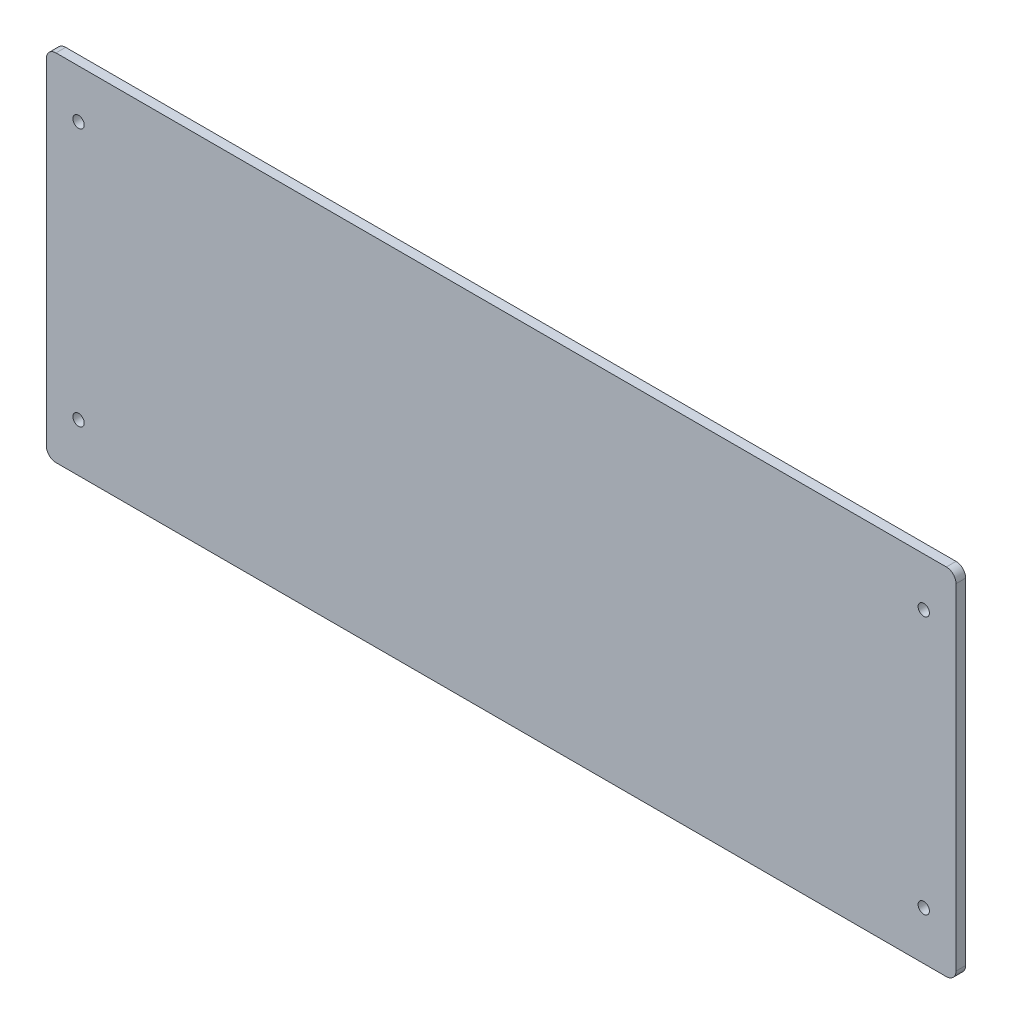
ISO-10303-21;
HEADER;
FILE_DESCRIPTION(('STEP AP214'),'2;1');
FILE_NAME('part.step','',(''),(''),'','','');
FILE_SCHEMA(('AUTOMOTIVE_DESIGN { 1 0 10303 214 1 1 1 1 }'));
ENDSEC;
DATA;
#1=APPLICATION_CONTEXT('core data for automotive mechanical design processes');
#2=APPLICATION_PROTOCOL_DEFINITION('international standard','automotive_design',2000,#1);
#3=PRODUCT_CONTEXT('',#1,'mechanical');
#4=PRODUCT('Part','Part','',(#3));
#5=PRODUCT_RELATED_PRODUCT_CATEGORY('part','',(#4));
#6=PRODUCT_DEFINITION_FORMATION('','',#4);
#7=PRODUCT_DEFINITION_CONTEXT('part definition',#1,'design');
#8=PRODUCT_DEFINITION('design','',#6,#7);
#9=PRODUCT_DEFINITION_SHAPE('','',#8);
#10=(LENGTH_UNIT() NAMED_UNIT(*) SI_UNIT(.MILLI.,.METRE.));
#11=(NAMED_UNIT(*) PLANE_ANGLE_UNIT() SI_UNIT($,.RADIAN.));
#12=(NAMED_UNIT(*) SI_UNIT($,.STERADIAN.) SOLID_ANGLE_UNIT());
#13=UNCERTAINTY_MEASURE_WITH_UNIT(LENGTH_MEASURE(1.E-05),#10,'distance_accuracy_value','');
#14=(GEOMETRIC_REPRESENTATION_CONTEXT(3) GLOBAL_UNCERTAINTY_ASSIGNED_CONTEXT((#13)) GLOBAL_UNIT_ASSIGNED_CONTEXT((#10,
#11,#12)) REPRESENTATION_CONTEXT('',''));
#15=CARTESIAN_POINT('',(0.,0.,0.));
#16=DIRECTION('',(0.,0.,1.));
#17=DIRECTION('',(1.,0.,0.));
#18=AXIS2_PLACEMENT_3D('',#15,#16,#17);
#19=CARTESIAN_POINT('',(-137.999999999996,227.000000000009,3.));
#20=DIRECTION('',(0.,0.,1.));
#21=DIRECTION('',(1.,0.,0.));
#22=AXIS2_PLACEMENT_3D('',#19,#20,#21);
#23=PLANE('',#22);
#24=CARTESIAN_POINT('',(130.999999999996,239.000000000009,3.));
#25=DIRECTION('',(0.,0.,1.));
#26=DIRECTION('',(-1.,0.,0.));
#27=AXIS2_PLACEMENT_3D('',#24,#25,#26);
#28=CIRCLE('',#27,1.75000000000001);
#29=CARTESIAN_POINT('',(129.249999999996,239.000000000009,3.));
#30=VERTEX_POINT('',#29);
#31=EDGE_CURVE('E225',#30,#30,#28,.T.);
#32=ORIENTED_EDGE('',*,*,#31,.F.);
#33=EDGE_LOOP('',(#32));
#34=FACE_BOUND('',#33,.T.);
#35=CARTESIAN_POINT('',(-130.999999999996,319.,3.));
#36=DIRECTION('',(0.,0.,1.));
#37=DIRECTION('',(1.,0.,0.));
#38=AXIS2_PLACEMENT_3D('',#35,#36,#37);
#39=CIRCLE('',#38,1.75000000000001);
#40=CARTESIAN_POINT('',(-129.249999999996,319.,3.));
#41=VERTEX_POINT('',#40);
#42=EDGE_CURVE('E150',#41,#41,#39,.T.);
#43=ORIENTED_EDGE('',*,*,#42,.F.);
#44=EDGE_LOOP('',(#43));
#45=FACE_BOUND('',#44,.T.);
#46=CARTESIAN_POINT('',(-137.999999999996,227.000000000009,3.));
#47=DIRECTION('',(0.,0.,1.));
#48=DIRECTION('',(1.,0.,0.));
#49=AXIS2_PLACEMENT_3D('',#46,#47,#48);
#50=CIRCLE('',#49,3.);
#51=CARTESIAN_POINT('',(-140.999999999996,227.000000000009,3.));
#52=VERTEX_POINT('',#51);
#53=CARTESIAN_POINT('',(-137.999999999996,224.000000000009,3.));
#54=VERTEX_POINT('',#53);
#55=EDGE_CURVE('E168',#52,#54,#50,.T.);
#56=ORIENTED_EDGE('',*,*,#55,.T.);
#57=DIRECTION('',(1.,0.,0.));
#58=VECTOR('',#57,1.);
#59=CARTESIAN_POINT('',(-137.999999999996,224.000000000009,3.));
#60=LINE('',#59,#58);
#61=CARTESIAN_POINT('',(138.,224.000000000009,3.));
#62=VERTEX_POINT('',#61);
#63=EDGE_CURVE('E104',#54,#62,#60,.T.);
#64=ORIENTED_EDGE('',*,*,#63,.T.);
#65=CARTESIAN_POINT('',(138.,227.000000000009,3.));
#66=DIRECTION('',(0.,0.,1.));
#67=DIRECTION('',(1.,0.,0.));
#68=AXIS2_PLACEMENT_3D('',#65,#66,#67);
#69=CIRCLE('',#68,3.);
#70=CARTESIAN_POINT('',(141.,227.000000000009,3.));
#71=VERTEX_POINT('',#70);
#72=EDGE_CURVE('E189',#62,#71,#69,.T.);
#73=ORIENTED_EDGE('',*,*,#72,.T.);
#74=DIRECTION('',(0.,1.,0.));
#75=VECTOR('',#74,1.);
#76=CARTESIAN_POINT('',(141.,331.,3.));
#77=LINE('',#76,#75);
#78=CARTESIAN_POINT('',(141.,331.,3.));
#79=VERTEX_POINT('',#78);
#80=EDGE_CURVE('E203',#71,#79,#77,.T.);
#81=ORIENTED_EDGE('',*,*,#80,.T.);
#82=CARTESIAN_POINT('',(138.,331.,3.));
#83=DIRECTION('',(0.,0.,1.));
#84=DIRECTION('',(-1.,0.,0.));
#85=AXIS2_PLACEMENT_3D('',#82,#83,#84);
#86=CIRCLE('',#85,3.);
#87=CARTESIAN_POINT('',(138.,334.,3.));
#88=VERTEX_POINT('',#87);
#89=EDGE_CURVE('E123',#79,#88,#86,.T.);
#90=ORIENTED_EDGE('',*,*,#89,.T.);
#91=DIRECTION('',(-1.,0.,0.));
#92=VECTOR('',#91,1.);
#93=CARTESIAN_POINT('',(-137.999999999996,334.,3.));
#94=LINE('',#93,#92);
#95=CARTESIAN_POINT('',(-137.999999999996,334.,3.));
#96=VERTEX_POINT('',#95);
#97=EDGE_CURVE('E117',#88,#96,#94,.T.);
#98=ORIENTED_EDGE('',*,*,#97,.T.);
#99=CARTESIAN_POINT('',(-137.999999999996,331.,3.));
#100=DIRECTION('',(0.,0.,1.));
#101=DIRECTION('',(1.,0.,0.));
#102=AXIS2_PLACEMENT_3D('',#99,#100,#101);
#103=CIRCLE('',#102,3.);
#104=CARTESIAN_POINT('',(-140.999999999996,331.,3.));
#105=VERTEX_POINT('',#104);
#106=EDGE_CURVE('E121',#96,#105,#103,.T.);
#107=ORIENTED_EDGE('',*,*,#106,.T.);
#108=DIRECTION('',(0.,-1.,0.));
#109=VECTOR('',#108,1.);
#110=CARTESIAN_POINT('',(-140.999999999996,331.,3.));
#111=LINE('',#110,#109);
#112=EDGE_CURVE('E61',#105,#52,#111,.T.);
#113=ORIENTED_EDGE('',*,*,#112,.T.);
#114=EDGE_LOOP('',(#56,#64,#73,#81,#90,#98,#107,#113));
#115=FACE_BOUND('',#114,.T.);
#116=CARTESIAN_POINT('',(-130.999999999996,239.000000000009,3.));
#117=DIRECTION('',(0.,0.,1.));
#118=DIRECTION('',(1.,0.,0.));
#119=AXIS2_PLACEMENT_3D('',#116,#117,#118);
#120=CIRCLE('',#119,1.75000000000001);
#121=CARTESIAN_POINT('',(-129.249999999996,239.000000000009,3.));
#122=VERTEX_POINT('',#121);
#123=EDGE_CURVE('E217',#122,#122,#120,.T.);
#124=ORIENTED_EDGE('',*,*,#123,.F.);
#125=EDGE_LOOP('',(#124));
#126=FACE_BOUND('',#125,.T.);
#127=CARTESIAN_POINT('',(130.999999999996,319.,3.));
#128=DIRECTION('',(0.,0.,1.));
#129=DIRECTION('',(-1.,0.,0.));
#130=AXIS2_PLACEMENT_3D('',#127,#128,#129);
#131=CIRCLE('',#130,1.75000000000001);
#132=CARTESIAN_POINT('',(129.249999999996,319.,3.));
#133=VERTEX_POINT('',#132);
#134=EDGE_CURVE('E233',#133,#133,#131,.T.);
#135=ORIENTED_EDGE('',*,*,#134,.F.);
#136=EDGE_LOOP('',(#135));
#137=FACE_BOUND('',#136,.T.);
#138=ADVANCED_FACE('F43',(#34,#45,#115,#126,#137),#23,.T.);
#139=CARTESIAN_POINT('',(-137.999999999996,227.000000000009,0.));
#140=DIRECTION('',(0.,0.,1.));
#141=DIRECTION('',(1.,0.,0.));
#142=AXIS2_PLACEMENT_3D('',#139,#140,#141);
#143=PLANE('',#142);
#144=CARTESIAN_POINT('',(-137.999999999996,227.000000000009,0.));
#145=DIRECTION('',(0.,0.,1.));
#146=DIRECTION('',(1.,0.,0.));
#147=AXIS2_PLACEMENT_3D('',#144,#145,#146);
#148=CIRCLE('',#147,3.);
#149=CARTESIAN_POINT('',(-140.999999999996,227.000000000009,0.));
#150=VERTEX_POINT('',#149);
#151=CARTESIAN_POINT('',(-137.999999999996,224.000000000009,0.));
#152=VERTEX_POINT('',#151);
#153=EDGE_CURVE('E145',#150,#152,#148,.T.);
#154=ORIENTED_EDGE('',*,*,#153,.F.);
#155=DIRECTION('',(0.,-1.,0.));
#156=VECTOR('',#155,1.);
#157=CARTESIAN_POINT('',(-140.999999999996,331.,0.));
#158=LINE('',#157,#156);
#159=CARTESIAN_POINT('',(-140.999999999996,331.,0.));
#160=VERTEX_POINT('',#159);
#161=EDGE_CURVE('E96',#160,#150,#158,.T.);
#162=ORIENTED_EDGE('',*,*,#161,.F.);
#163=CARTESIAN_POINT('',(-137.999999999996,331.,0.));
#164=DIRECTION('',(0.,0.,1.));
#165=DIRECTION('',(1.,0.,0.));
#166=AXIS2_PLACEMENT_3D('',#163,#164,#165);
#167=CIRCLE('',#166,3.);
#168=CARTESIAN_POINT('',(-137.999999999996,334.,0.));
#169=VERTEX_POINT('',#168);
#170=EDGE_CURVE('E90',#169,#160,#167,.T.);
#171=ORIENTED_EDGE('',*,*,#170,.F.);
#172=DIRECTION('',(-1.,0.,0.));
#173=VECTOR('',#172,1.);
#174=CARTESIAN_POINT('',(-137.999999999996,334.,0.));
#175=LINE('',#174,#173);
#176=CARTESIAN_POINT('',(138.,334.,0.));
#177=VERTEX_POINT('',#176);
#178=EDGE_CURVE('E132',#177,#169,#175,.T.);
#179=ORIENTED_EDGE('',*,*,#178,.F.);
#180=CARTESIAN_POINT('',(138.,331.,0.));
#181=DIRECTION('',(0.,0.,1.));
#182=DIRECTION('',(-1.,0.,0.));
#183=AXIS2_PLACEMENT_3D('',#180,#181,#182);
#184=CIRCLE('',#183,3.);
#185=CARTESIAN_POINT('',(141.,331.,0.));
#186=VERTEX_POINT('',#185);
#187=EDGE_CURVE('E159',#186,#177,#184,.T.);
#188=ORIENTED_EDGE('',*,*,#187,.F.);
#189=DIRECTION('',(0.,1.,0.));
#190=VECTOR('',#189,1.);
#191=CARTESIAN_POINT('',(141.,331.,0.));
#192=LINE('',#191,#190);
#193=CARTESIAN_POINT('',(141.,227.000000000009,0.));
#194=VERTEX_POINT('',#193);
#195=EDGE_CURVE('E156',#194,#186,#192,.T.);
#196=ORIENTED_EDGE('',*,*,#195,.F.);
#197=CARTESIAN_POINT('',(138.,227.000000000009,0.));
#198=DIRECTION('',(0.,0.,1.));
#199=DIRECTION('',(1.,0.,0.));
#200=AXIS2_PLACEMENT_3D('',#197,#198,#199);
#201=CIRCLE('',#200,3.);
#202=CARTESIAN_POINT('',(138.,224.000000000009,0.));
#203=VERTEX_POINT('',#202);
#204=EDGE_CURVE('E153',#203,#194,#201,.T.);
#205=ORIENTED_EDGE('',*,*,#204,.F.);
#206=DIRECTION('',(1.,0.,0.));
#207=VECTOR('',#206,1.);
#208=CARTESIAN_POINT('',(-137.999999999996,224.000000000009,0.));
#209=LINE('',#208,#207);
#210=EDGE_CURVE('E149',#152,#203,#209,.T.);
#211=ORIENTED_EDGE('',*,*,#210,.F.);
#212=EDGE_LOOP('',(#154,#162,#171,#179,#188,#196,#205,#211));
#213=FACE_BOUND('',#212,.T.);
#214=CARTESIAN_POINT('',(-130.999999999996,319.,0.));
#215=DIRECTION('',(0.,0.,1.));
#216=DIRECTION('',(1.,0.,0.));
#217=AXIS2_PLACEMENT_3D('',#214,#215,#216);
#218=CIRCLE('',#217,1.75000000000001);
#219=CARTESIAN_POINT('',(-129.249999999996,319.,0.));
#220=VERTEX_POINT('',#219);
#221=EDGE_CURVE('E213',#220,#220,#218,.T.);
#222=ORIENTED_EDGE('',*,*,#221,.T.);
#223=EDGE_LOOP('',(#222));
#224=FACE_BOUND('',#223,.T.);
#225=CARTESIAN_POINT('',(-130.999999999996,239.000000000009,0.));
#226=DIRECTION('',(0.,0.,1.));
#227=DIRECTION('',(1.,0.,0.));
#228=AXIS2_PLACEMENT_3D('',#225,#226,#227);
#229=CIRCLE('',#228,1.75000000000001);
#230=CARTESIAN_POINT('',(-129.249999999996,239.000000000009,0.));
#231=VERTEX_POINT('',#230);
#232=EDGE_CURVE('E221',#231,#231,#229,.T.);
#233=ORIENTED_EDGE('',*,*,#232,.T.);
#234=EDGE_LOOP('',(#233));
#235=FACE_BOUND('',#234,.T.);
#236=CARTESIAN_POINT('',(130.999999999996,239.000000000009,0.));
#237=DIRECTION('',(0.,0.,1.));
#238=DIRECTION('',(-1.,0.,0.));
#239=AXIS2_PLACEMENT_3D('',#236,#237,#238);
#240=CIRCLE('',#239,1.75000000000001);
#241=CARTESIAN_POINT('',(129.249999999996,239.000000000009,0.));
#242=VERTEX_POINT('',#241);
#243=EDGE_CURVE('E229',#242,#242,#240,.T.);
#244=ORIENTED_EDGE('',*,*,#243,.T.);
#245=EDGE_LOOP('',(#244));
#246=FACE_BOUND('',#245,.T.);
#247=CARTESIAN_POINT('',(130.999999999996,319.,0.));
#248=DIRECTION('',(0.,0.,1.));
#249=DIRECTION('',(-1.,0.,0.));
#250=AXIS2_PLACEMENT_3D('',#247,#248,#249);
#251=CIRCLE('',#250,1.75000000000001);
#252=CARTESIAN_POINT('',(129.249999999996,319.,0.));
#253=VERTEX_POINT('',#252);
#254=EDGE_CURVE('E237',#253,#253,#251,.T.);
#255=ORIENTED_EDGE('',*,*,#254,.T.);
#256=EDGE_LOOP('',(#255));
#257=FACE_BOUND('',#256,.T.);
#258=ADVANCED_FACE('F193',(#213,#224,#235,#246,#257),#143,.F.);
#259=CARTESIAN_POINT('',(-137.999999999996,227.000000000009,3.));
#260=DIRECTION('',(0.,0.,-1.));
#261=DIRECTION('',(-1.,0.,0.));
#262=AXIS2_PLACEMENT_3D('',#259,#260,#261);
#263=CYLINDRICAL_SURFACE('',#262,3.);
#264=ORIENTED_EDGE('',*,*,#153,.T.);
#265=DIRECTION('',(0.,0.,-1.));
#266=VECTOR('',#265,1.);
#267=CARTESIAN_POINT('',(-137.999999999996,224.000000000009,3.));
#268=LINE('',#267,#266);
#269=EDGE_CURVE('E11',#54,#152,#268,.T.);
#270=ORIENTED_EDGE('',*,*,#269,.F.);
#271=ORIENTED_EDGE('',*,*,#55,.F.);
#272=DIRECTION('',(0.,0.,-1.));
#273=VECTOR('',#272,1.);
#274=CARTESIAN_POINT('',(-140.999999999996,227.000000000009,3.));
#275=LINE('',#274,#273);
#276=EDGE_CURVE('E141',#52,#150,#275,.T.);
#277=ORIENTED_EDGE('',*,*,#276,.T.);
#278=EDGE_LOOP('',(#264,#270,#271,#277));
#279=FACE_BOUND('',#278,.T.);
#280=ADVANCED_FACE('F45',(#279),#263,.T.);
#281=CARTESIAN_POINT('',(-137.999999999996,224.000000000009,3.));
#282=DIRECTION('',(0.,1.,0.));
#283=DIRECTION('',(0.,0.,1.));
#284=AXIS2_PLACEMENT_3D('',#281,#282,#283);
#285=PLANE('',#284);
#286=ORIENTED_EDGE('',*,*,#210,.T.);
#287=DIRECTION('',(0.,0.,-1.));
#288=VECTOR('',#287,1.);
#289=CARTESIAN_POINT('',(138.,224.000000000009,3.));
#290=LINE('',#289,#288);
#291=EDGE_CURVE('E53',#62,#203,#290,.T.);
#292=ORIENTED_EDGE('',*,*,#291,.F.);
#293=ORIENTED_EDGE('',*,*,#63,.F.);
#294=ORIENTED_EDGE('',*,*,#269,.T.);
#295=EDGE_LOOP('',(#286,#292,#293,#294));
#296=FACE_BOUND('',#295,.T.);
#297=ADVANCED_FACE('F273',(#296),#285,.F.);
#298=CARTESIAN_POINT('',(138.,227.000000000009,3.));
#299=DIRECTION('',(0.,0.,-1.));
#300=DIRECTION('',(-1.,0.,0.));
#301=AXIS2_PLACEMENT_3D('',#298,#299,#300);
#302=CYLINDRICAL_SURFACE('',#301,3.);
#303=ORIENTED_EDGE('',*,*,#204,.T.);
#304=DIRECTION('',(0.,0.,-1.));
#305=VECTOR('',#304,1.);
#306=CARTESIAN_POINT('',(141.,227.000000000009,3.));
#307=LINE('',#306,#305);
#308=EDGE_CURVE('E179',#71,#194,#307,.T.);
#309=ORIENTED_EDGE('',*,*,#308,.F.);
#310=ORIENTED_EDGE('',*,*,#72,.F.);
#311=ORIENTED_EDGE('',*,*,#291,.T.);
#312=EDGE_LOOP('',(#303,#309,#310,#311));
#313=FACE_BOUND('',#312,.T.);
#314=ADVANCED_FACE('F187',(#313),#302,.T.);
#315=CARTESIAN_POINT('',(141.,331.,3.));
#316=DIRECTION('',(-1.,0.,0.));
#317=DIRECTION('',(0.,0.,1.));
#318=AXIS2_PLACEMENT_3D('',#315,#316,#317);
#319=PLANE('',#318);
#320=ORIENTED_EDGE('',*,*,#195,.T.);
#321=DIRECTION('',(0.,0.,-1.));
#322=VECTOR('',#321,1.);
#323=CARTESIAN_POINT('',(141.,331.,3.));
#324=LINE('',#323,#322);
#325=EDGE_CURVE('E175',#79,#186,#324,.T.);
#326=ORIENTED_EDGE('',*,*,#325,.F.);
#327=ORIENTED_EDGE('',*,*,#80,.F.);
#328=ORIENTED_EDGE('',*,*,#308,.T.);
#329=EDGE_LOOP('',(#320,#326,#327,#328));
#330=FACE_BOUND('',#329,.T.);
#331=ADVANCED_FACE('F198',(#330),#319,.F.);
#332=CARTESIAN_POINT('',(138.,331.,3.));
#333=DIRECTION('',(0.,0.,-1.));
#334=DIRECTION('',(-1.,0.,0.));
#335=AXIS2_PLACEMENT_3D('',#332,#333,#334);
#336=CYLINDRICAL_SURFACE('',#335,3.);
#337=ORIENTED_EDGE('',*,*,#187,.T.);
#338=DIRECTION('',(0.,0.,-1.));
#339=VECTOR('',#338,1.);
#340=CARTESIAN_POINT('',(138.,334.,3.));
#341=LINE('',#340,#339);
#342=EDGE_CURVE('E134',#88,#177,#341,.T.);
#343=ORIENTED_EDGE('',*,*,#342,.F.);
#344=ORIENTED_EDGE('',*,*,#89,.F.);
#345=ORIENTED_EDGE('',*,*,#325,.T.);
#346=EDGE_LOOP('',(#337,#343,#344,#345));
#347=FACE_BOUND('',#346,.T.);
#348=ADVANCED_FACE('F201',(#347),#336,.T.);
#349=CARTESIAN_POINT('',(-137.999999999996,334.,3.));
#350=DIRECTION('',(0.,-1.,0.));
#351=DIRECTION('',(0.,0.,-1.));
#352=AXIS2_PLACEMENT_3D('',#349,#350,#351);
#353=PLANE('',#352);
#354=ORIENTED_EDGE('',*,*,#178,.T.);
#355=DIRECTION('',(0.,0.,-1.));
#356=VECTOR('',#355,1.);
#357=CARTESIAN_POINT('',(-137.999999999996,334.,3.));
#358=LINE('',#357,#356);
#359=EDGE_CURVE('E129',#96,#169,#358,.T.);
#360=ORIENTED_EDGE('',*,*,#359,.F.);
#361=ORIENTED_EDGE('',*,*,#97,.F.);
#362=ORIENTED_EDGE('',*,*,#342,.T.);
#363=EDGE_LOOP('',(#354,#360,#361,#362));
#364=FACE_BOUND('',#363,.T.);
#365=ADVANCED_FACE('F130',(#364),#353,.F.);
#366=CARTESIAN_POINT('',(-137.999999999996,331.,3.));
#367=DIRECTION('',(0.,0.,-1.));
#368=DIRECTION('',(-1.,0.,0.));
#369=AXIS2_PLACEMENT_3D('',#366,#367,#368);
#370=CYLINDRICAL_SURFACE('',#369,3.);
#371=ORIENTED_EDGE('',*,*,#170,.T.);
#372=DIRECTION('',(0.,0.,-1.));
#373=VECTOR('',#372,1.);
#374=CARTESIAN_POINT('',(-140.999999999996,331.,3.));
#375=LINE('',#374,#373);
#376=EDGE_CURVE('E135',#105,#160,#375,.T.);
#377=ORIENTED_EDGE('',*,*,#376,.F.);
#378=ORIENTED_EDGE('',*,*,#106,.F.);
#379=ORIENTED_EDGE('',*,*,#359,.T.);
#380=EDGE_LOOP('',(#371,#377,#378,#379));
#381=FACE_BOUND('',#380,.T.);
#382=ADVANCED_FACE('F137',(#381),#370,.T.);
#383=CARTESIAN_POINT('',(-140.999999999996,331.,3.));
#384=DIRECTION('',(1.,0.,0.));
#385=DIRECTION('',(0.,0.,-1.));
#386=AXIS2_PLACEMENT_3D('',#383,#384,#385);
#387=PLANE('',#386);
#388=ORIENTED_EDGE('',*,*,#161,.T.);
#389=ORIENTED_EDGE('',*,*,#276,.F.);
#390=ORIENTED_EDGE('',*,*,#112,.F.);
#391=ORIENTED_EDGE('',*,*,#376,.T.);
#392=EDGE_LOOP('',(#388,#389,#390,#391));
#393=FACE_BOUND('',#392,.T.);
#394=ADVANCED_FACE('F261',(#393),#387,.F.);
#395=CARTESIAN_POINT('',(-130.999999999996,319.,3.));
#396=DIRECTION('',(0.,0.,-1.));
#397=DIRECTION('',(-1.,0.,0.));
#398=AXIS2_PLACEMENT_3D('',#395,#396,#397);
#399=CYLINDRICAL_SURFACE('',#398,1.75000000000001);
#400=ORIENTED_EDGE('',*,*,#42,.T.);
#401=EDGE_LOOP('',(#400));
#402=FACE_BOUND('',#401,.T.);
#403=ORIENTED_EDGE('',*,*,#221,.F.);
#404=EDGE_LOOP('',(#403));
#405=FACE_BOUND('',#404,.T.);
#406=ADVANCED_FACE('F258',(#402,#405),#399,.F.);
#407=CARTESIAN_POINT('',(-130.999999999996,239.000000000009,3.));
#408=DIRECTION('',(0.,0.,-1.));
#409=DIRECTION('',(-1.,0.,0.));
#410=AXIS2_PLACEMENT_3D('',#407,#408,#409);
#411=CYLINDRICAL_SURFACE('',#410,1.75000000000001);
#412=ORIENTED_EDGE('',*,*,#123,.T.);
#413=EDGE_LOOP('',(#412));
#414=FACE_BOUND('',#413,.T.);
#415=ORIENTED_EDGE('',*,*,#232,.F.);
#416=EDGE_LOOP('',(#415));
#417=FACE_BOUND('',#416,.T.);
#418=ADVANCED_FACE('F349',(#414,#417),#411,.F.);
#419=CARTESIAN_POINT('',(130.999999999996,239.000000000009,3.));
#420=DIRECTION('',(0.,0.,-1.));
#421=DIRECTION('',(-1.,0.,0.));
#422=AXIS2_PLACEMENT_3D('',#419,#420,#421);
#423=CYLINDRICAL_SURFACE('',#422,1.75000000000001);
#424=ORIENTED_EDGE('',*,*,#31,.T.);
#425=EDGE_LOOP('',(#424));
#426=FACE_BOUND('',#425,.T.);
#427=ORIENTED_EDGE('',*,*,#243,.F.);
#428=EDGE_LOOP('',(#427));
#429=FACE_BOUND('',#428,.T.);
#430=ADVANCED_FACE('F358',(#426,#429),#423,.F.);
#431=CARTESIAN_POINT('',(130.999999999996,319.,3.));
#432=DIRECTION('',(0.,0.,-1.));
#433=DIRECTION('',(-1.,0.,0.));
#434=AXIS2_PLACEMENT_3D('',#431,#432,#433);
#435=CYLINDRICAL_SURFACE('',#434,1.75000000000001);
#436=ORIENTED_EDGE('',*,*,#134,.T.);
#437=EDGE_LOOP('',(#436));
#438=FACE_BOUND('',#437,.T.);
#439=ORIENTED_EDGE('',*,*,#254,.F.);
#440=EDGE_LOOP('',(#439));
#441=FACE_BOUND('',#440,.T.);
#442=ADVANCED_FACE('F245',(#438,#441),#435,.F.);
#443=CLOSED_SHELL('',(#138,#258,#280,#297,#314,#331,#348,#365,#382,#394,#406,#418,#430,#442));
#444=MANIFOLD_SOLID_BREP('B2',#443);
#445=ADVANCED_BREP_SHAPE_REPRESENTATION('',(#18,#444),#14);
#446=SHAPE_DEFINITION_REPRESENTATION(#9,#445);
ENDSEC;
END-ISO-10303-21;
